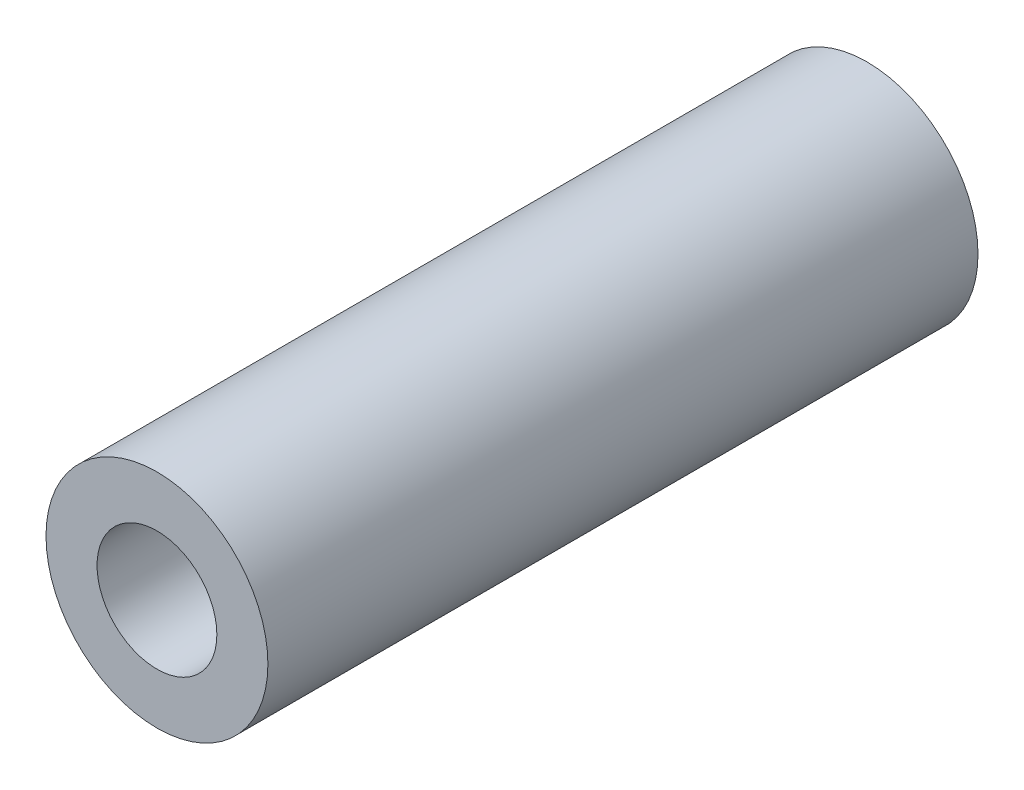
ISO-10303-21;
HEADER;
FILE_DESCRIPTION(('STEP AP214'),'2;1');
FILE_NAME('part.step','',(''),(''),'','','');
FILE_SCHEMA(('AUTOMOTIVE_DESIGN { 1 0 10303 214 1 1 1 1 }'));
ENDSEC;
DATA;
#1=APPLICATION_CONTEXT('core data for automotive mechanical design processes');
#2=APPLICATION_PROTOCOL_DEFINITION('international standard','automotive_design',2000,#1);
#3=PRODUCT_CONTEXT('',#1,'mechanical');
#4=PRODUCT('Part','Part','',(#3));
#5=PRODUCT_RELATED_PRODUCT_CATEGORY('part','',(#4));
#6=PRODUCT_DEFINITION_FORMATION('','',#4);
#7=PRODUCT_DEFINITION_CONTEXT('part definition',#1,'design');
#8=PRODUCT_DEFINITION('design','',#6,#7);
#9=PRODUCT_DEFINITION_SHAPE('','',#8);
#10=(LENGTH_UNIT() NAMED_UNIT(*) SI_UNIT(.MILLI.,.METRE.));
#11=(NAMED_UNIT(*) PLANE_ANGLE_UNIT() SI_UNIT($,.RADIAN.));
#12=(NAMED_UNIT(*) SI_UNIT($,.STERADIAN.) SOLID_ANGLE_UNIT());
#13=UNCERTAINTY_MEASURE_WITH_UNIT(LENGTH_MEASURE(1.E-05),#10,'distance_accuracy_value','');
#14=(GEOMETRIC_REPRESENTATION_CONTEXT(3) GLOBAL_UNCERTAINTY_ASSIGNED_CONTEXT((#13)) GLOBAL_UNIT_ASSIGNED_CONTEXT((#10,
#11,#12)) REPRESENTATION_CONTEXT('',''));
#15=CARTESIAN_POINT('',(0.,0.,0.));
#16=DIRECTION('',(0.,0.,1.));
#17=DIRECTION('',(1.,0.,0.));
#18=AXIS2_PLACEMENT_3D('',#15,#16,#17);
#19=CARTESIAN_POINT('',(0.,0.,16.));
#20=DIRECTION('',(0.,0.,-1.));
#21=DIRECTION('',(-1.,0.,0.));
#22=AXIS2_PLACEMENT_3D('',#19,#20,#21);
#23=CYLINDRICAL_SURFACE('',#22,2.5);
#24=CARTESIAN_POINT('',(0.,0.,16.));
#25=DIRECTION('',(0.,0.,1.));
#26=DIRECTION('',(1.,0.,0.));
#27=AXIS2_PLACEMENT_3D('',#24,#25,#26);
#28=CIRCLE('',#27,2.5);
#29=CARTESIAN_POINT('',(2.5,0.,16.));
#30=VERTEX_POINT('',#29);
#31=EDGE_CURVE('E10',#30,#30,#28,.T.);
#32=ORIENTED_EDGE('',*,*,#31,.F.);
#33=EDGE_LOOP('',(#32));
#34=FACE_BOUND('',#33,.T.);
#35=CARTESIAN_POINT('',(0.,0.,0.));
#36=DIRECTION('',(0.,0.,1.));
#37=DIRECTION('',(1.,0.,0.));
#38=AXIS2_PLACEMENT_3D('',#35,#36,#37);
#39=CIRCLE('',#38,2.5);
#40=CARTESIAN_POINT('',(2.5,0.,0.));
#41=VERTEX_POINT('',#40);
#42=EDGE_CURVE('E34',#41,#41,#39,.T.);
#43=ORIENTED_EDGE('',*,*,#42,.T.);
#44=EDGE_LOOP('',(#43));
#45=FACE_BOUND('',#44,.T.);
#46=ADVANCED_FACE('F31',(#34,#45),#23,.T.);
#47=CARTESIAN_POINT('',(0.,0.,16.));
#48=DIRECTION('',(0.,0.,1.));
#49=DIRECTION('',(1.,0.,0.));
#50=AXIS2_PLACEMENT_3D('',#47,#48,#49);
#51=PLANE('',#50);
#52=CARTESIAN_POINT('',(0.,0.,16.));
#53=DIRECTION('',(0.,0.,1.));
#54=DIRECTION('',(1.,0.,0.));
#55=AXIS2_PLACEMENT_3D('',#52,#53,#54);
#56=CIRCLE('',#55,1.35);
#57=CARTESIAN_POINT('',(1.35,0.,16.));
#58=VERTEX_POINT('',#57);
#59=EDGE_CURVE('E45',#58,#58,#56,.T.);
#60=ORIENTED_EDGE('',*,*,#59,.F.);
#61=EDGE_LOOP('',(#60));
#62=FACE_BOUND('',#61,.T.);
#63=ORIENTED_EDGE('',*,*,#31,.T.);
#64=EDGE_LOOP('',(#63));
#65=FACE_BOUND('',#64,.T.);
#66=ADVANCED_FACE('F51',(#62,#65),#51,.T.);
#67=CARTESIAN_POINT('',(0.,0.,0.));
#68=DIRECTION('',(0.,0.,1.));
#69=DIRECTION('',(1.,0.,0.));
#70=AXIS2_PLACEMENT_3D('',#67,#68,#69);
#71=PLANE('',#70);
#72=CARTESIAN_POINT('',(0.,0.,0.));
#73=DIRECTION('',(0.,0.,1.));
#74=DIRECTION('',(1.,0.,0.));
#75=AXIS2_PLACEMENT_3D('',#72,#73,#74);
#76=CIRCLE('',#75,1.35);
#77=CARTESIAN_POINT('',(1.35,0.,0.));
#78=VERTEX_POINT('',#77);
#79=EDGE_CURVE('E41',#78,#78,#76,.T.);
#80=ORIENTED_EDGE('',*,*,#79,.T.);
#81=EDGE_LOOP('',(#80));
#82=FACE_BOUND('',#81,.T.);
#83=ORIENTED_EDGE('',*,*,#42,.F.);
#84=EDGE_LOOP('',(#83));
#85=FACE_BOUND('',#84,.T.);
#86=ADVANCED_FACE('F53',(#82,#85),#71,.F.);
#87=CARTESIAN_POINT('',(0.,0.,16.));
#88=DIRECTION('',(0.,0.,1.));
#89=DIRECTION('',(1.,0.,0.));
#90=AXIS2_PLACEMENT_3D('',#87,#88,#89);
#91=CYLINDRICAL_SURFACE('',#90,1.35);
#92=ORIENTED_EDGE('',*,*,#79,.F.);
#93=EDGE_LOOP('',(#92));
#94=FACE_BOUND('',#93,.T.);
#95=ORIENTED_EDGE('',*,*,#59,.T.);
#96=EDGE_LOOP('',(#95));
#97=FACE_BOUND('',#96,.T.);
#98=ADVANCED_FACE('F49',(#94,#97),#91,.F.);
#99=CLOSED_SHELL('',(#46,#66,#86,#98));
#100=MANIFOLD_SOLID_BREP('B2',#99);
#101=ADVANCED_BREP_SHAPE_REPRESENTATION('',(#18,#100),#14);
#102=SHAPE_DEFINITION_REPRESENTATION(#9,#101);
ENDSEC;
END-ISO-10303-21;
